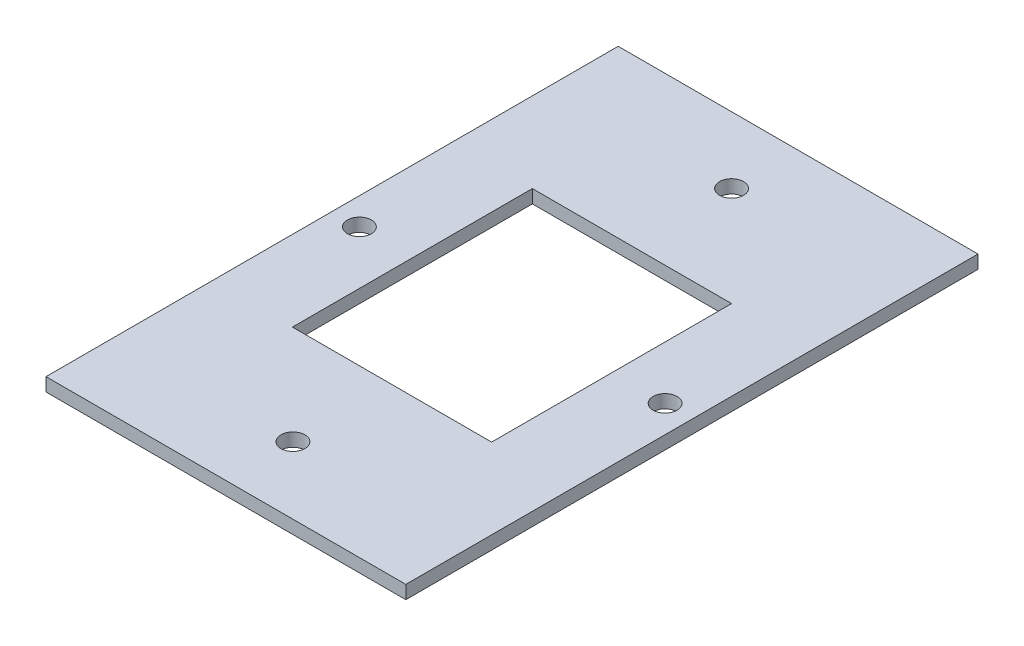
ISO-10303-21;
HEADER;
FILE_DESCRIPTION(('STEP AP214'),'2;1');
FILE_NAME('part.step','',(''),(''),'','','');
FILE_SCHEMA(('AUTOMOTIVE_DESIGN { 1 0 10303 214 1 1 1 1 }'));
ENDSEC;
DATA;
#1=APPLICATION_CONTEXT('core data for automotive mechanical design processes');
#2=APPLICATION_PROTOCOL_DEFINITION('international standard','automotive_design',2000,#1);
#3=PRODUCT_CONTEXT('',#1,'mechanical');
#4=PRODUCT('Part','Part','',(#3));
#5=PRODUCT_RELATED_PRODUCT_CATEGORY('part','',(#4));
#6=PRODUCT_DEFINITION_FORMATION('','',#4);
#7=PRODUCT_DEFINITION_CONTEXT('part definition',#1,'design');
#8=PRODUCT_DEFINITION('design','',#6,#7);
#9=PRODUCT_DEFINITION_SHAPE('','',#8);
#10=(LENGTH_UNIT() NAMED_UNIT(*) SI_UNIT(.MILLI.,.METRE.));
#11=(NAMED_UNIT(*) PLANE_ANGLE_UNIT() SI_UNIT($,.RADIAN.));
#12=(NAMED_UNIT(*) SI_UNIT($,.STERADIAN.) SOLID_ANGLE_UNIT());
#13=UNCERTAINTY_MEASURE_WITH_UNIT(LENGTH_MEASURE(1.E-05),#10,'distance_accuracy_value','');
#14=(GEOMETRIC_REPRESENTATION_CONTEXT(3) GLOBAL_UNCERTAINTY_ASSIGNED_CONTEXT((#13)) GLOBAL_UNIT_ASSIGNED_CONTEXT((#10,
#11,#12)) REPRESENTATION_CONTEXT('',''));
#15=CARTESIAN_POINT('',(0.,0.,0.));
#16=DIRECTION('',(0.,0.,1.));
#17=DIRECTION('',(1.,0.,0.));
#18=AXIS2_PLACEMENT_3D('',#15,#16,#17);
#19=CARTESIAN_POINT('',(27.07,2.,43.05));
#20=DIRECTION('',(-1.,0.,0.));
#21=DIRECTION('',(0.,0.,1.));
#22=AXIS2_PLACEMENT_3D('',#19,#20,#21);
#23=PLANE('',#22);
#24=DIRECTION('',(0.,0.,-1.));
#25=VECTOR('',#24,1.);
#26=CARTESIAN_POINT('',(27.07,0.,43.05));
#27=LINE('',#26,#25);
#28=CARTESIAN_POINT('',(27.07,0.,43.05));
#29=VERTEX_POINT('',#28);
#30=CARTESIAN_POINT('',(27.07,0.,-43.05));
#31=VERTEX_POINT('',#30);
#32=EDGE_CURVE('E187',#29,#31,#27,.T.);
#33=ORIENTED_EDGE('',*,*,#32,.T.);
#34=DIRECTION('',(0.,-1.,0.));
#35=VECTOR('',#34,1.);
#36=CARTESIAN_POINT('',(27.07,2.,-43.05));
#37=LINE('',#36,#35);
#38=CARTESIAN_POINT('',(27.07,2.,-43.05));
#39=VERTEX_POINT('',#38);
#40=EDGE_CURVE('E11',#39,#31,#37,.T.);
#41=ORIENTED_EDGE('',*,*,#40,.F.);
#42=DIRECTION('',(0.,0.,-1.));
#43=VECTOR('',#42,1.);
#44=CARTESIAN_POINT('',(27.07,2.,43.05));
#45=LINE('',#44,#43);
#46=CARTESIAN_POINT('',(27.07,2.,43.05));
#47=VERTEX_POINT('',#46);
#48=EDGE_CURVE('E172',#47,#39,#45,.T.);
#49=ORIENTED_EDGE('',*,*,#48,.F.);
#50=DIRECTION('',(0.,-1.,0.));
#51=VECTOR('',#50,1.);
#52=CARTESIAN_POINT('',(27.07,2.,43.05));
#53=LINE('',#52,#51);
#54=EDGE_CURVE('E186',#47,#29,#53,.T.);
#55=ORIENTED_EDGE('',*,*,#54,.T.);
#56=EDGE_LOOP('',(#33,#41,#49,#55));
#57=FACE_BOUND('',#56,.T.);
#58=ADVANCED_FACE('F44',(#57),#23,.F.);
#59=CARTESIAN_POINT('',(-27.07,2.,-43.05));
#60=DIRECTION('',(0.,0.,1.));
#61=DIRECTION('',(1.,0.,0.));
#62=AXIS2_PLACEMENT_3D('',#59,#60,#61);
#63=PLANE('',#62);
#64=DIRECTION('',(-1.,0.,0.));
#65=VECTOR('',#64,1.);
#66=CARTESIAN_POINT('',(-27.07,0.,-43.05));
#67=LINE('',#66,#65);
#68=CARTESIAN_POINT('',(-27.07,0.,-43.05));
#69=VERTEX_POINT('',#68);
#70=EDGE_CURVE('E191',#31,#69,#67,.T.);
#71=ORIENTED_EDGE('',*,*,#70,.T.);
#72=DIRECTION('',(0.,-1.,0.));
#73=VECTOR('',#72,1.);
#74=CARTESIAN_POINT('',(-27.07,2.,-43.05));
#75=LINE('',#74,#73);
#76=CARTESIAN_POINT('',(-27.07,2.,-43.05));
#77=VERTEX_POINT('',#76);
#78=EDGE_CURVE('E52',#77,#69,#75,.T.);
#79=ORIENTED_EDGE('',*,*,#78,.F.);
#80=DIRECTION('',(-1.,0.,0.));
#81=VECTOR('',#80,1.);
#82=CARTESIAN_POINT('',(-27.07,2.,-43.05));
#83=LINE('',#82,#81);
#84=EDGE_CURVE('E176',#39,#77,#83,.T.);
#85=ORIENTED_EDGE('',*,*,#84,.F.);
#86=ORIENTED_EDGE('',*,*,#40,.T.);
#87=EDGE_LOOP('',(#71,#79,#85,#86));
#88=FACE_BOUND('',#87,.T.);
#89=ADVANCED_FACE('F227',(#88),#63,.F.);
#90=CARTESIAN_POINT('',(-27.07,2.,43.05));
#91=DIRECTION('',(1.,0.,0.));
#92=DIRECTION('',(0.,0.,-1.));
#93=AXIS2_PLACEMENT_3D('',#90,#91,#92);
#94=PLANE('',#93);
#95=DIRECTION('',(0.,0.,1.));
#96=VECTOR('',#95,1.);
#97=CARTESIAN_POINT('',(-27.07,0.,43.05));
#98=LINE('',#97,#96);
#99=CARTESIAN_POINT('',(-27.07,0.,43.05));
#100=VERTEX_POINT('',#99);
#101=EDGE_CURVE('E195',#69,#100,#98,.T.);
#102=ORIENTED_EDGE('',*,*,#101,.T.);
#103=DIRECTION('',(0.,-1.,0.));
#104=VECTOR('',#103,1.);
#105=CARTESIAN_POINT('',(-27.07,2.,43.05));
#106=LINE('',#105,#104);
#107=CARTESIAN_POINT('',(-27.07,2.,43.05));
#108=VERTEX_POINT('',#107);
#109=EDGE_CURVE('E203',#108,#100,#106,.T.);
#110=ORIENTED_EDGE('',*,*,#109,.F.);
#111=DIRECTION('',(0.,0.,1.));
#112=VECTOR('',#111,1.);
#113=CARTESIAN_POINT('',(-27.07,2.,43.05));
#114=LINE('',#113,#112);
#115=EDGE_CURVE('E180',#77,#108,#114,.T.);
#116=ORIENTED_EDGE('',*,*,#115,.F.);
#117=ORIENTED_EDGE('',*,*,#78,.T.);
#118=EDGE_LOOP('',(#102,#110,#116,#117));
#119=FACE_BOUND('',#118,.T.);
#120=ADVANCED_FACE('F212',(#119),#94,.F.);
#121=CARTESIAN_POINT('',(-27.07,2.,43.05));
#122=DIRECTION('',(0.,0.,-1.));
#123=DIRECTION('',(-1.,0.,0.));
#124=AXIS2_PLACEMENT_3D('',#121,#122,#123);
#125=PLANE('',#124);
#126=DIRECTION('',(1.,0.,0.));
#127=VECTOR('',#126,1.);
#128=CARTESIAN_POINT('',(-27.07,0.,43.05));
#129=LINE('',#128,#127);
#130=EDGE_CURVE('E177',#100,#29,#129,.T.);
#131=ORIENTED_EDGE('',*,*,#130,.T.);
#132=ORIENTED_EDGE('',*,*,#54,.F.);
#133=DIRECTION('',(1.,0.,0.));
#134=VECTOR('',#133,1.);
#135=CARTESIAN_POINT('',(-27.07,2.,43.05));
#136=LINE('',#135,#134);
#137=EDGE_CURVE('E183',#108,#47,#136,.T.);
#138=ORIENTED_EDGE('',*,*,#137,.F.);
#139=ORIENTED_EDGE('',*,*,#109,.T.);
#140=EDGE_LOOP('',(#131,#132,#138,#139));
#141=FACE_BOUND('',#140,.T.);
#142=ADVANCED_FACE('F221',(#141),#125,.F.);
#143=CARTESIAN_POINT('',(0.,2.,0.));
#144=DIRECTION('',(0.,-1.,0.));
#145=DIRECTION('',(0.,0.,-1.));
#146=AXIS2_PLACEMENT_3D('',#143,#144,#145);
#147=PLANE('',#146);
#148=CARTESIAN_POINT('',(22.987279404105,2.,-0.0499999999999806));
#149=DIRECTION('',(0.,1.,0.));
#150=DIRECTION('',(0.,0.,1.));
#151=AXIS2_PLACEMENT_3D('',#148,#149,#150);
#152=CIRCLE('',#151,1.79999999999999);
#153=CARTESIAN_POINT('',(22.987279404105,2.,1.75000000000001));
#154=VERTEX_POINT('',#153);
#155=EDGE_CURVE('E159',#154,#154,#152,.T.);
#156=ORIENTED_EDGE('',*,*,#155,.F.);
#157=EDGE_LOOP('',(#156));
#158=FACE_BOUND('',#157,.T.);
#159=DIRECTION('',(-1.,0.,0.));
#160=VECTOR('',#159,1.);
#161=CARTESIAN_POINT('',(-14.987279404105,2.,-18.05));
#162=LINE('',#161,#160);
#163=CARTESIAN_POINT('',(14.987279404105,2.,-18.05));
#164=VERTEX_POINT('',#163);
#165=CARTESIAN_POINT('',(-14.987279404105,2.,-18.05));
#166=VERTEX_POINT('',#165);
#167=EDGE_CURVE('E131',#164,#166,#162,.T.);
#168=ORIENTED_EDGE('',*,*,#167,.F.);
#169=DIRECTION('',(0.,0.,-1.));
#170=VECTOR('',#169,1.);
#171=CARTESIAN_POINT('',(14.987279404105,2.,18.05));
#172=LINE('',#171,#170);
#173=CARTESIAN_POINT('',(14.987279404105,2.,18.05));
#174=VERTEX_POINT('',#173);
#175=EDGE_CURVE('E59',#174,#164,#172,.T.);
#176=ORIENTED_EDGE('',*,*,#175,.F.);
#177=DIRECTION('',(1.,0.,0.));
#178=VECTOR('',#177,1.);
#179=CARTESIAN_POINT('',(-14.987279404105,2.,18.05));
#180=LINE('',#179,#178);
#181=CARTESIAN_POINT('',(-14.987279404105,2.,18.05));
#182=VERTEX_POINT('',#181);
#183=EDGE_CURVE('E119',#182,#174,#180,.T.);
#184=ORIENTED_EDGE('',*,*,#183,.F.);
#185=DIRECTION('',(0.,0.,1.));
#186=VECTOR('',#185,1.);
#187=CARTESIAN_POINT('',(-14.987279404105,2.,18.05));
#188=LINE('',#187,#186);
#189=EDGE_CURVE('E125',#166,#182,#188,.T.);
#190=ORIENTED_EDGE('',*,*,#189,.F.);
#191=EDGE_LOOP('',(#168,#176,#184,#190));
#192=FACE_BOUND('',#191,.T.);
#193=CARTESIAN_POINT('',(-23.012720595895,2.,-0.0499999999999757));
#194=DIRECTION('',(0.,1.,0.));
#195=DIRECTION('',(0.,0.,1.));
#196=AXIS2_PLACEMENT_3D('',#193,#194,#195);
#197=CIRCLE('',#196,1.79999999999999);
#198=CARTESIAN_POINT('',(-23.012720595895,2.,1.75000000000002));
#199=VERTEX_POINT('',#198);
#200=EDGE_CURVE('E138',#199,#199,#197,.T.);
#201=ORIENTED_EDGE('',*,*,#200,.F.);
#202=EDGE_LOOP('',(#201));
#203=FACE_BOUND('',#202,.T.);
#204=CARTESIAN_POINT('',(-0.0127205958949697,2.,32.95));
#205=DIRECTION('',(0.,1.,0.));
#206=DIRECTION('',(0.,0.,1.));
#207=AXIS2_PLACEMENT_3D('',#204,#205,#206);
#208=CIRCLE('',#207,1.8);
#209=CARTESIAN_POINT('',(-0.0127205958949697,2.,34.75));
#210=VERTEX_POINT('',#209);
#211=EDGE_CURVE('E164',#210,#210,#208,.T.);
#212=ORIENTED_EDGE('',*,*,#211,.F.);
#213=EDGE_LOOP('',(#212));
#214=FACE_BOUND('',#213,.T.);
#215=CARTESIAN_POINT('',(-0.0127205958950074,2.,-33.05));
#216=DIRECTION('',(0.,1.,0.));
#217=DIRECTION('',(0.,0.,1.));
#218=AXIS2_PLACEMENT_3D('',#215,#216,#217);
#219=CIRCLE('',#218,1.8);
#220=CARTESIAN_POINT('',(-0.0127205958950074,2.,-31.25));
#221=VERTEX_POINT('',#220);
#222=EDGE_CURVE('E155',#221,#221,#219,.T.);
#223=ORIENTED_EDGE('',*,*,#222,.F.);
#224=EDGE_LOOP('',(#223));
#225=FACE_BOUND('',#224,.T.);
#226=ORIENTED_EDGE('',*,*,#48,.T.);
#227=ORIENTED_EDGE('',*,*,#84,.T.);
#228=ORIENTED_EDGE('',*,*,#115,.T.);
#229=ORIENTED_EDGE('',*,*,#137,.T.);
#230=EDGE_LOOP('',(#226,#227,#228,#229));
#231=FACE_BOUND('',#230,.T.);
#232=ADVANCED_FACE('F128',(#158,#192,#203,#214,#225,#231),#147,.F.);
#233=CARTESIAN_POINT('',(0.,0.,0.));
#234=DIRECTION('',(0.,-1.,0.));
#235=DIRECTION('',(0.,0.,-1.));
#236=AXIS2_PLACEMENT_3D('',#233,#234,#235);
#237=PLANE('',#236);
#238=CARTESIAN_POINT('',(22.987279404105,0.,-0.0499999999999806));
#239=DIRECTION('',(0.,1.,0.));
#240=DIRECTION('',(0.,0.,1.));
#241=AXIS2_PLACEMENT_3D('',#238,#239,#240);
#242=CIRCLE('',#241,1.79999999999999);
#243=CARTESIAN_POINT('',(22.987279404105,0.,1.75000000000001));
#244=VERTEX_POINT('',#243);
#245=EDGE_CURVE('E192',#244,#244,#242,.T.);
#246=ORIENTED_EDGE('',*,*,#245,.T.);
#247=EDGE_LOOP('',(#246));
#248=FACE_BOUND('',#247,.T.);
#249=DIRECTION('',(0.,0.,-1.));
#250=VECTOR('',#249,1.);
#251=CARTESIAN_POINT('',(14.987279404105,0.,18.05));
#252=LINE('',#251,#250);
#253=CARTESIAN_POINT('',(14.987279404105,0.,18.05));
#254=VERTEX_POINT('',#253);
#255=CARTESIAN_POINT('',(14.987279404105,0.,-18.05));
#256=VERTEX_POINT('',#255);
#257=EDGE_CURVE('E111',#254,#256,#252,.T.);
#258=ORIENTED_EDGE('',*,*,#257,.T.);
#259=DIRECTION('',(-1.,0.,0.));
#260=VECTOR('',#259,1.);
#261=CARTESIAN_POINT('',(-14.987279404105,0.,-18.05));
#262=LINE('',#261,#260);
#263=CARTESIAN_POINT('',(-14.987279404105,0.,-18.05));
#264=VERTEX_POINT('',#263);
#265=EDGE_CURVE('E149',#256,#264,#262,.T.);
#266=ORIENTED_EDGE('',*,*,#265,.T.);
#267=DIRECTION('',(0.,0.,1.));
#268=VECTOR('',#267,1.);
#269=CARTESIAN_POINT('',(-14.987279404105,0.,18.05));
#270=LINE('',#269,#268);
#271=CARTESIAN_POINT('',(-14.987279404105,0.,18.05));
#272=VERTEX_POINT('',#271);
#273=EDGE_CURVE('E67',#264,#272,#270,.T.);
#274=ORIENTED_EDGE('',*,*,#273,.T.);
#275=DIRECTION('',(1.,0.,0.));
#276=VECTOR('',#275,1.);
#277=CARTESIAN_POINT('',(-14.987279404105,0.,18.05));
#278=LINE('',#277,#276);
#279=EDGE_CURVE('E143',#272,#254,#278,.T.);
#280=ORIENTED_EDGE('',*,*,#279,.T.);
#281=EDGE_LOOP('',(#258,#266,#274,#280));
#282=FACE_BOUND('',#281,.T.);
#283=CARTESIAN_POINT('',(-23.012720595895,0.,-0.0499999999999757));
#284=DIRECTION('',(0.,1.,0.));
#285=DIRECTION('',(0.,0.,1.));
#286=AXIS2_PLACEMENT_3D('',#283,#284,#285);
#287=CIRCLE('',#286,1.79999999999999);
#288=CARTESIAN_POINT('',(-23.012720595895,0.,1.75000000000002));
#289=VERTEX_POINT('',#288);
#290=EDGE_CURVE('E133',#289,#289,#287,.T.);
#291=ORIENTED_EDGE('',*,*,#290,.T.);
#292=EDGE_LOOP('',(#291));
#293=FACE_BOUND('',#292,.T.);
#294=CARTESIAN_POINT('',(-0.0127205958949697,0.,32.95));
#295=DIRECTION('',(0.,1.,0.));
#296=DIRECTION('',(0.,0.,1.));
#297=AXIS2_PLACEMENT_3D('',#294,#295,#296);
#298=CIRCLE('',#297,1.8);
#299=CARTESIAN_POINT('',(-0.0127205958949697,0.,34.75));
#300=VERTEX_POINT('',#299);
#301=EDGE_CURVE('E168',#300,#300,#298,.T.);
#302=ORIENTED_EDGE('',*,*,#301,.T.);
#303=EDGE_LOOP('',(#302));
#304=FACE_BOUND('',#303,.T.);
#305=CARTESIAN_POINT('',(-0.0127205958950074,0.,-33.05));
#306=DIRECTION('',(0.,1.,0.));
#307=DIRECTION('',(0.,0.,1.));
#308=AXIS2_PLACEMENT_3D('',#305,#306,#307);
#309=CIRCLE('',#308,1.8);
#310=CARTESIAN_POINT('',(-0.0127205958950074,0.,-31.25));
#311=VERTEX_POINT('',#310);
#312=EDGE_CURVE('E160',#311,#311,#309,.T.);
#313=ORIENTED_EDGE('',*,*,#312,.T.);
#314=EDGE_LOOP('',(#313));
#315=FACE_BOUND('',#314,.T.);
#316=ORIENTED_EDGE('',*,*,#32,.F.);
#317=ORIENTED_EDGE('',*,*,#130,.F.);
#318=ORIENTED_EDGE('',*,*,#101,.F.);
#319=ORIENTED_EDGE('',*,*,#70,.F.);
#320=EDGE_LOOP('',(#316,#317,#318,#319));
#321=FACE_BOUND('',#320,.T.);
#322=ADVANCED_FACE('F218',(#248,#282,#293,#304,#315,#321),#237,.T.);
#323=CARTESIAN_POINT('',(-0.0127205958950074,0.,-33.05));
#324=DIRECTION('',(0.,1.,0.));
#325=DIRECTION('',(0.,0.,1.));
#326=AXIS2_PLACEMENT_3D('',#323,#324,#325);
#327=CYLINDRICAL_SURFACE('',#326,1.8);
#328=ORIENTED_EDGE('',*,*,#312,.F.);
#329=EDGE_LOOP('',(#328));
#330=FACE_BOUND('',#329,.T.);
#331=ORIENTED_EDGE('',*,*,#222,.T.);
#332=EDGE_LOOP('',(#331));
#333=FACE_BOUND('',#332,.T.);
#334=ADVANCED_FACE('F239',(#330,#333),#327,.F.);
#335=CARTESIAN_POINT('',(-0.0127205958949697,0.,32.95));
#336=DIRECTION('',(0.,1.,0.));
#337=DIRECTION('',(0.,0.,1.));
#338=AXIS2_PLACEMENT_3D('',#335,#336,#337);
#339=CYLINDRICAL_SURFACE('',#338,1.8);
#340=ORIENTED_EDGE('',*,*,#301,.F.);
#341=EDGE_LOOP('',(#340));
#342=FACE_BOUND('',#341,.T.);
#343=ORIENTED_EDGE('',*,*,#211,.T.);
#344=EDGE_LOOP('',(#343));
#345=FACE_BOUND('',#344,.T.);
#346=ADVANCED_FACE('F244',(#342,#345),#339,.F.);
#347=CARTESIAN_POINT('',(-23.012720595895,0.,-0.0499999999999757));
#348=DIRECTION('',(0.,1.,0.));
#349=DIRECTION('',(0.,0.,1.));
#350=AXIS2_PLACEMENT_3D('',#347,#348,#349);
#351=CYLINDRICAL_SURFACE('',#350,1.79999999999999);
#352=ORIENTED_EDGE('',*,*,#290,.F.);
#353=EDGE_LOOP('',(#352));
#354=FACE_BOUND('',#353,.T.);
#355=ORIENTED_EDGE('',*,*,#200,.T.);
#356=EDGE_LOOP('',(#355));
#357=FACE_BOUND('',#356,.T.);
#358=ADVANCED_FACE('F247',(#354,#357),#351,.F.);
#359=CARTESIAN_POINT('',(14.987279404105,0.,18.05));
#360=DIRECTION('',(1.,0.,0.));
#361=DIRECTION('',(0.,0.,-1.));
#362=AXIS2_PLACEMENT_3D('',#359,#360,#361);
#363=PLANE('',#362);
#364=ORIENTED_EDGE('',*,*,#175,.T.);
#365=DIRECTION('',(0.,1.,0.));
#366=VECTOR('',#365,1.);
#367=CARTESIAN_POINT('',(14.987279404105,0.,-18.05));
#368=LINE('',#367,#366);
#369=EDGE_CURVE('E146',#256,#164,#368,.T.);
#370=ORIENTED_EDGE('',*,*,#369,.F.);
#371=ORIENTED_EDGE('',*,*,#257,.F.);
#372=DIRECTION('',(0.,1.,0.));
#373=VECTOR('',#372,1.);
#374=CARTESIAN_POINT('',(14.987279404105,0.,18.05));
#375=LINE('',#374,#373);
#376=EDGE_CURVE('E107',#254,#174,#375,.T.);
#377=ORIENTED_EDGE('',*,*,#376,.T.);
#378=EDGE_LOOP('',(#364,#370,#371,#377));
#379=FACE_BOUND('',#378,.T.);
#380=ADVANCED_FACE('F109',(#379),#363,.F.);
#381=CARTESIAN_POINT('',(-14.987279404105,0.,18.05));
#382=DIRECTION('',(0.,0.,1.));
#383=DIRECTION('',(1.,0.,0.));
#384=AXIS2_PLACEMENT_3D('',#381,#382,#383);
#385=PLANE('',#384);
#386=ORIENTED_EDGE('',*,*,#183,.T.);
#387=ORIENTED_EDGE('',*,*,#376,.F.);
#388=ORIENTED_EDGE('',*,*,#279,.F.);
#389=DIRECTION('',(0.,1.,0.));
#390=VECTOR('',#389,1.);
#391=CARTESIAN_POINT('',(-14.987279404105,0.,18.05));
#392=LINE('',#391,#390);
#393=EDGE_CURVE('E116',#272,#182,#392,.T.);
#394=ORIENTED_EDGE('',*,*,#393,.T.);
#395=EDGE_LOOP('',(#386,#387,#388,#394));
#396=FACE_BOUND('',#395,.T.);
#397=ADVANCED_FACE('F120',(#396),#385,.F.);
#398=CARTESIAN_POINT('',(-14.987279404105,0.,18.05));
#399=DIRECTION('',(-1.,0.,0.));
#400=DIRECTION('',(0.,0.,1.));
#401=AXIS2_PLACEMENT_3D('',#398,#399,#400);
#402=PLANE('',#401);
#403=ORIENTED_EDGE('',*,*,#189,.T.);
#404=ORIENTED_EDGE('',*,*,#393,.F.);
#405=ORIENTED_EDGE('',*,*,#273,.F.);
#406=DIRECTION('',(0.,1.,0.));
#407=VECTOR('',#406,1.);
#408=CARTESIAN_POINT('',(-14.987279404105,0.,-18.05));
#409=LINE('',#408,#407);
#410=EDGE_CURVE('E286',#264,#166,#409,.T.);
#411=ORIENTED_EDGE('',*,*,#410,.T.);
#412=EDGE_LOOP('',(#403,#404,#405,#411));
#413=FACE_BOUND('',#412,.T.);
#414=ADVANCED_FACE('F254',(#413),#402,.F.);
#415=CARTESIAN_POINT('',(-14.987279404105,0.,-18.05));
#416=DIRECTION('',(0.,0.,-1.));
#417=DIRECTION('',(-1.,0.,0.));
#418=AXIS2_PLACEMENT_3D('',#415,#416,#417);
#419=PLANE('',#418);
#420=ORIENTED_EDGE('',*,*,#167,.T.);
#421=ORIENTED_EDGE('',*,*,#410,.F.);
#422=ORIENTED_EDGE('',*,*,#265,.F.);
#423=ORIENTED_EDGE('',*,*,#369,.T.);
#424=EDGE_LOOP('',(#420,#421,#422,#423));
#425=FACE_BOUND('',#424,.T.);
#426=ADVANCED_FACE('F257',(#425),#419,.F.);
#427=CARTESIAN_POINT('',(22.987279404105,0.,-0.0499999999999806));
#428=DIRECTION('',(0.,1.,0.));
#429=DIRECTION('',(0.,0.,1.));
#430=AXIS2_PLACEMENT_3D('',#427,#428,#429);
#431=CYLINDRICAL_SURFACE('',#430,1.79999999999999);
#432=ORIENTED_EDGE('',*,*,#245,.F.);
#433=EDGE_LOOP('',(#432));
#434=FACE_BOUND('',#433,.T.);
#435=ORIENTED_EDGE('',*,*,#155,.T.);
#436=EDGE_LOOP('',(#435));
#437=FACE_BOUND('',#436,.T.);
#438=ADVANCED_FACE('F260',(#434,#437),#431,.F.);
#439=CLOSED_SHELL('',(#58,#89,#120,#142,#232,#322,#334,#346,#358,#380,#397,#414,#426,#438));
#440=MANIFOLD_SOLID_BREP('B2',#439);
#441=ADVANCED_BREP_SHAPE_REPRESENTATION('',(#18,#440),#14);
#442=SHAPE_DEFINITION_REPRESENTATION(#9,#441);
ENDSEC;
END-ISO-10303-21;
